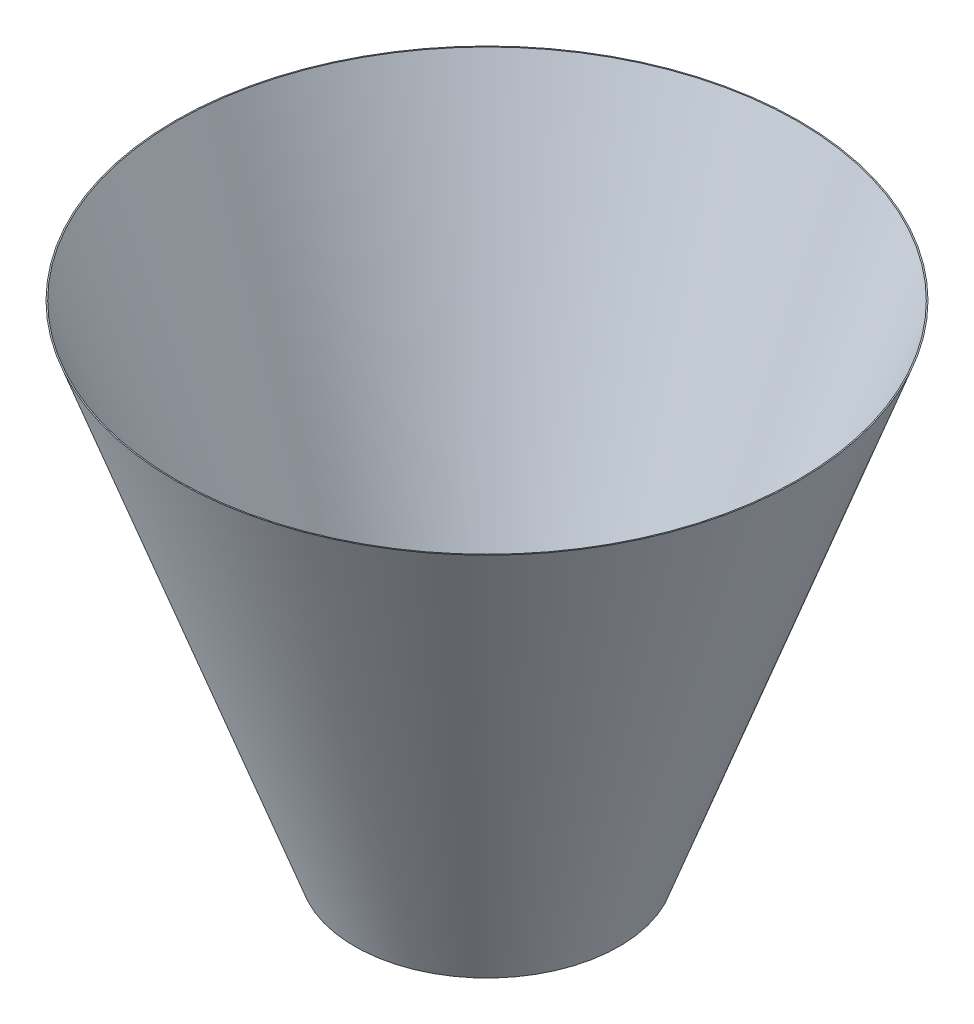
ISO-10303-21;
HEADER;
FILE_DESCRIPTION(('STEP AP214'),'2;1');
FILE_NAME('part.step','',(''),(''),'','','');
FILE_SCHEMA(('AUTOMOTIVE_DESIGN { 1 0 10303 214 1 1 1 1 }'));
ENDSEC;
DATA;
#1=APPLICATION_CONTEXT('core data for automotive mechanical design processes');
#2=APPLICATION_PROTOCOL_DEFINITION('international standard','automotive_design',2000,#1);
#3=PRODUCT_CONTEXT('',#1,'mechanical');
#4=PRODUCT('Part','Part','',(#3));
#5=PRODUCT_RELATED_PRODUCT_CATEGORY('part','',(#4));
#6=PRODUCT_DEFINITION_FORMATION('','',#4);
#7=PRODUCT_DEFINITION_CONTEXT('part definition',#1,'design');
#8=PRODUCT_DEFINITION('design','',#6,#7);
#9=PRODUCT_DEFINITION_SHAPE('','',#8);
#10=(LENGTH_UNIT() NAMED_UNIT(*) SI_UNIT(.MILLI.,.METRE.));
#11=(NAMED_UNIT(*) PLANE_ANGLE_UNIT() SI_UNIT($,.RADIAN.));
#12=(NAMED_UNIT(*) SI_UNIT($,.STERADIAN.) SOLID_ANGLE_UNIT());
#13=UNCERTAINTY_MEASURE_WITH_UNIT(LENGTH_MEASURE(1.E-05),#10,'distance_accuracy_value','');
#14=(GEOMETRIC_REPRESENTATION_CONTEXT(3) GLOBAL_UNCERTAINTY_ASSIGNED_CONTEXT((#13)) GLOBAL_UNIT_ASSIGNED_CONTEXT((#10,
#11,#12)) REPRESENTATION_CONTEXT('',''));
#15=CARTESIAN_POINT('',(0.,0.,0.));
#16=DIRECTION('',(0.,0.,1.));
#17=DIRECTION('',(1.,0.,0.));
#18=AXIS2_PLACEMENT_3D('',#15,#16,#17);
#19=CARTESIAN_POINT('',(375.3656323,0.,0.));
#20=DIRECTION('',(0.,-1.,0.));
#21=DIRECTION('',(0.,0.,-1.));
#22=AXIS2_PLACEMENT_3D('',#19,#20,#21);
#23=PLANE('',#22);
#24=CARTESIAN_POINT('',(0.,0.,0.));
#25=DIRECTION('',(0.,-1.,0.));
#26=DIRECTION('',(0.,0.,-1.));
#27=AXIS2_PLACEMENT_3D('',#24,#25,#26);
#28=CIRCLE('',#27,378.744396727611);
#29=CARTESIAN_POINT('',(0.,0.,-378.744396727611));
#30=VERTEX_POINT('',#29);
#31=EDGE_CURVE('E10',#30,#30,#28,.T.);
#32=ORIENTED_EDGE('',*,*,#31,.T.);
#33=EDGE_LOOP('',(#32));
#34=FACE_BOUND('',#33,.T.);
#35=CARTESIAN_POINT('',(0.,0.,0.));
#36=DIRECTION('',(0.,-1.,0.));
#37=DIRECTION('',(0.,0.,-1.));
#38=AXIS2_PLACEMENT_3D('',#35,#36,#37);
#39=CIRCLE('',#38,375.3656323);
#40=CARTESIAN_POINT('',(0.,0.,-375.3656323));
#41=VERTEX_POINT('',#40);
#42=EDGE_CURVE('E45',#41,#41,#39,.T.);
#43=ORIENTED_EDGE('',*,*,#42,.F.);
#44=EDGE_LOOP('',(#43));
#45=FACE_BOUND('',#44,.T.);
#46=ADVANCED_FACE('F31',(#34,#45),#23,.T.);
#47=CARTESIAN_POINT('',(0.,0.,0.));
#48=DIRECTION('',(0.,1.,0.));
#49=DIRECTION('',(0.,0.,1.));
#50=AXIS2_PLACEMENT_3D('',#47,#48,#49);
#51=CONICAL_SURFACE('',#50,378.744396727611,0.349065850398863);
#52=CARTESIAN_POINT('',(0.,1411.19882711162,0.));
#53=DIRECTION('',(0.,-1.,0.));
#54=DIRECTION('',(0.,0.,-1.));
#55=AXIS2_PLACEMENT_3D('',#52,#53,#54);
#56=CIRCLE('',#55,892.378764427611);
#57=CARTESIAN_POINT('',(0.,1411.19882711162,-892.378764427611));
#58=VERTEX_POINT('',#57);
#59=EDGE_CURVE('E37',#58,#58,#56,.T.);
#60=ORIENTED_EDGE('',*,*,#59,.T.);
#61=EDGE_LOOP('',(#60));
#62=FACE_BOUND('',#61,.T.);
#63=ORIENTED_EDGE('',*,*,#31,.F.);
#64=EDGE_LOOP('',(#63));
#65=FACE_BOUND('',#64,.T.);
#66=ADVANCED_FACE('F55',(#62,#65),#51,.T.);
#67=CARTESIAN_POINT('',(892.378764427611,1411.19882711162,0.));
#68=DIRECTION('',(0.,1.,0.));
#69=DIRECTION('',(0.,0.,1.));
#70=AXIS2_PLACEMENT_3D('',#67,#68,#69);
#71=PLANE('',#70);
#72=CARTESIAN_POINT('',(0.,1411.19882711162,0.));
#73=DIRECTION('',(0.,-1.,0.));
#74=DIRECTION('',(0.,0.,-1.));
#75=AXIS2_PLACEMENT_3D('',#72,#73,#74);
#76=CIRCLE('',#75,889.);
#77=CARTESIAN_POINT('',(0.,1411.19882711162,-889.));
#78=VERTEX_POINT('',#77);
#79=EDGE_CURVE('E41',#78,#78,#76,.T.);
#80=ORIENTED_EDGE('',*,*,#79,.T.);
#81=EDGE_LOOP('',(#80));
#82=FACE_BOUND('',#81,.T.);
#83=ORIENTED_EDGE('',*,*,#59,.F.);
#84=EDGE_LOOP('',(#83));
#85=FACE_BOUND('',#84,.T.);
#86=ADVANCED_FACE('F59',(#82,#85),#71,.T.);
#87=CARTESIAN_POINT('',(0.,1411.19882711162,0.));
#88=DIRECTION('',(0.,1.,0.));
#89=DIRECTION('',(0.,0.,1.));
#90=AXIS2_PLACEMENT_3D('',#87,#88,#89);
#91=CONICAL_SURFACE('',#90,889.,0.349065850398863);
#92=ORIENTED_EDGE('',*,*,#42,.T.);
#93=EDGE_LOOP('',(#92));
#94=FACE_BOUND('',#93,.T.);
#95=ORIENTED_EDGE('',*,*,#79,.F.);
#96=EDGE_LOOP('',(#95));
#97=FACE_BOUND('',#96,.T.);
#98=ADVANCED_FACE('F51',(#94,#97),#91,.F.);
#99=CLOSED_SHELL('',(#46,#66,#86,#98));
#100=MANIFOLD_SOLID_BREP('B2',#99);
#101=ADVANCED_BREP_SHAPE_REPRESENTATION('',(#18,#100),#14);
#102=SHAPE_DEFINITION_REPRESENTATION(#9,#101);
ENDSEC;
END-ISO-10303-21;
